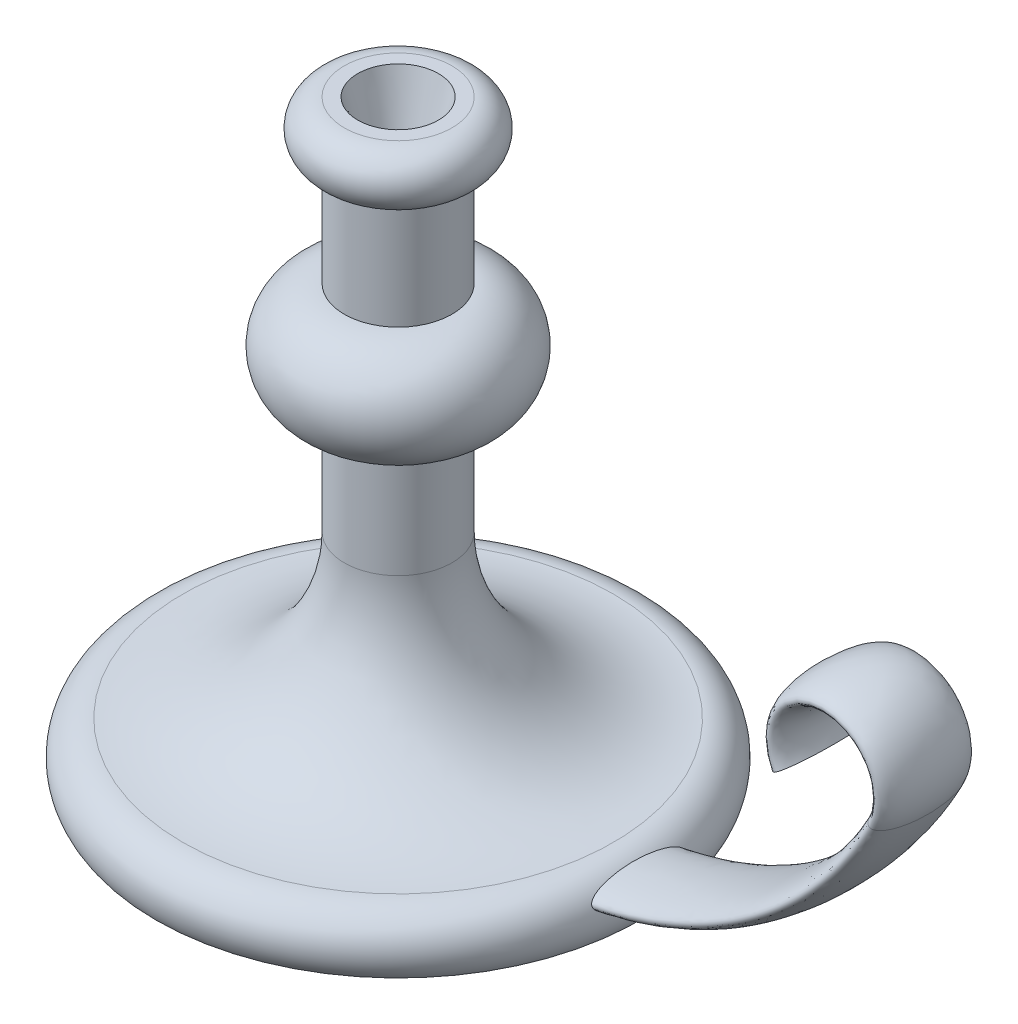
ISO-10303-21;
HEADER;
FILE_DESCRIPTION(('STEP AP214'),'2;1');
FILE_NAME('part.step','',(''),(''),'','','');
FILE_SCHEMA(('AUTOMOTIVE_DESIGN { 1 0 10303 214 1 1 1 1 }'));
ENDSEC;
DATA;
#1=APPLICATION_CONTEXT('core data for automotive mechanical design processes');
#2=APPLICATION_PROTOCOL_DEFINITION('international standard','automotive_design',2000,#1);
#3=PRODUCT_CONTEXT('',#1,'mechanical');
#4=PRODUCT('Part','Part','',(#3));
#5=PRODUCT_RELATED_PRODUCT_CATEGORY('part','',(#4));
#6=PRODUCT_DEFINITION_FORMATION('','',#4);
#7=PRODUCT_DEFINITION_CONTEXT('part definition',#1,'design');
#8=PRODUCT_DEFINITION('design','',#6,#7);
#9=PRODUCT_DEFINITION_SHAPE('','',#8);
#10=(LENGTH_UNIT() NAMED_UNIT(*) SI_UNIT(.MILLI.,.METRE.));
#11=(NAMED_UNIT(*) PLANE_ANGLE_UNIT() SI_UNIT($,.RADIAN.));
#12=(NAMED_UNIT(*) SI_UNIT($,.STERADIAN.) SOLID_ANGLE_UNIT());
#13=UNCERTAINTY_MEASURE_WITH_UNIT(LENGTH_MEASURE(1.E-05),#10,'distance_accuracy_value','');
#14=(GEOMETRIC_REPRESENTATION_CONTEXT(3) GLOBAL_UNCERTAINTY_ASSIGNED_CONTEXT((#13)) GLOBAL_UNIT_ASSIGNED_CONTEXT((#10,
#11,#12)) REPRESENTATION_CONTEXT('',''));
#15=CARTESIAN_POINT('',(0.,0.,0.));
#16=DIRECTION('',(0.,0.,1.));
#17=DIRECTION('',(1.,0.,0.));
#18=AXIS2_PLACEMENT_3D('',#15,#16,#17);
#19=CARTESIAN_POINT('',(90.,0.,0.));
#20=DIRECTION('',(0.,-1.,0.));
#21=DIRECTION('',(0.,0.,-1.));
#22=AXIS2_PLACEMENT_3D('',#19,#20,#21);
#23=PLANE('',#22);
#24=CARTESIAN_POINT('',(0.,0.,0.));
#25=DIRECTION('',(0.,-1.,0.));
#26=DIRECTION('',(0.,0.,-1.));
#27=AXIS2_PLACEMENT_3D('',#24,#25,#26);
#28=CIRCLE('',#27,90.);
#29=CARTESIAN_POINT('',(0.,0.,-90.));
#30=VERTEX_POINT('',#29);
#31=EDGE_CURVE('E79',#30,#30,#28,.T.);
#32=ORIENTED_EDGE('',*,*,#31,.T.);
#33=EDGE_LOOP('',(#32));
#34=FACE_BOUND('',#33,.T.);
#35=ADVANCED_FACE('F39',(#34),#23,.T.);
#36=CARTESIAN_POINT('',(0.,220.,0.));
#37=DIRECTION('',(0.,1.,0.));
#38=DIRECTION('',(0.,0.,1.));
#39=AXIS2_PLACEMENT_3D('',#36,#37,#38);
#40=PLANE('',#39);
#41=CARTESIAN_POINT('',(0.,220.,0.));
#42=DIRECTION('',(0.,1.,0.));
#43=DIRECTION('',(0.,0.,1.));
#44=AXIS2_PLACEMENT_3D('',#41,#42,#43);
#45=CIRCLE('',#44,15.);
#46=CARTESIAN_POINT('',(0.,220.,15.));
#47=VERTEX_POINT('',#46);
#48=EDGE_CURVE('E95',#47,#47,#45,.T.);
#49=ORIENTED_EDGE('',*,*,#48,.F.);
#50=EDGE_LOOP('',(#49));
#51=FACE_BOUND('',#50,.T.);
#52=CARTESIAN_POINT('',(0.,220.,0.));
#53=DIRECTION('',(0.,-1.,0.));
#54=DIRECTION('',(0.,0.,-1.));
#55=AXIS2_PLACEMENT_3D('',#52,#53,#54);
#56=CIRCLE('',#55,20.);
#57=CARTESIAN_POINT('',(0.,220.,-20.));
#58=VERTEX_POINT('',#57);
#59=EDGE_CURVE('E51',#58,#58,#56,.T.);
#60=ORIENTED_EDGE('',*,*,#59,.F.);
#61=EDGE_LOOP('',(#60));
#62=FACE_BOUND('',#61,.T.);
#63=ADVANCED_FACE('F102',(#51,#62),#40,.T.);
#64=CARTESIAN_POINT('',(0.,210.,0.));
#65=DIRECTION('',(0.,-1.,0.));
#66=DIRECTION('',(0.,0.,-1.));
#67=AXIS2_PLACEMENT_3D('',#64,#65,#66);
#68=TOROIDAL_SURFACE('',#67,20.,10.);
#69=ORIENTED_EDGE('',*,*,#59,.T.);
#70=EDGE_LOOP('',(#69));
#71=FACE_BOUND('',#70,.T.);
#72=CARTESIAN_POINT('',(0.,200.,0.));
#73=DIRECTION('',(0.,-1.,0.));
#74=DIRECTION('',(0.,0.,-1.));
#75=AXIS2_PLACEMENT_3D('',#72,#73,#74);
#76=CIRCLE('',#75,20.);
#77=CARTESIAN_POINT('',(0.,200.,-20.));
#78=VERTEX_POINT('',#77);
#79=EDGE_CURVE('E56',#78,#78,#76,.T.);
#80=ORIENTED_EDGE('',*,*,#79,.F.);
#81=EDGE_LOOP('',(#80));
#82=FACE_BOUND('',#81,.T.);
#83=ADVANCED_FACE('F105',(#71,#82),#68,.T.);
#84=CARTESIAN_POINT('',(0.,0.,0.));
#85=DIRECTION('',(0.,-1.,0.));
#86=DIRECTION('',(0.,0.,-1.));
#87=AXIS2_PLACEMENT_3D('',#84,#85,#86);
#88=CYLINDRICAL_SURFACE('',#87,20.);
#89=ORIENTED_EDGE('',*,*,#79,.T.);
#90=EDGE_LOOP('',(#89));
#91=FACE_BOUND('',#90,.T.);
#92=CARTESIAN_POINT('',(0.,160.,0.));
#93=DIRECTION('',(0.,-1.,0.));
#94=DIRECTION('',(0.,0.,-1.));
#95=AXIS2_PLACEMENT_3D('',#92,#93,#94);
#96=CIRCLE('',#95,20.);
#97=CARTESIAN_POINT('',(0.,160.,-20.));
#98=VERTEX_POINT('',#97);
#99=EDGE_CURVE('E61',#98,#98,#96,.T.);
#100=ORIENTED_EDGE('',*,*,#99,.F.);
#101=EDGE_LOOP('',(#100));
#102=FACE_BOUND('',#101,.T.);
#103=ADVANCED_FACE('F110',(#91,#102),#88,.T.);
#104=CARTESIAN_POINT('',(0.,140.,0.));
#105=DIRECTION('',(0.,-1.,0.));
#106=DIRECTION('',(0.,0.,-1.));
#107=AXIS2_PLACEMENT_3D('',#104,#105,#106);
#108=TOROIDAL_SURFACE('',#107,20.,20.);
#109=ORIENTED_EDGE('',*,*,#99,.T.);
#110=EDGE_LOOP('',(#109));
#111=FACE_BOUND('',#110,.T.);
#112=CARTESIAN_POINT('',(0.,120.,0.));
#113=DIRECTION('',(0.,-1.,0.));
#114=DIRECTION('',(0.,0.,-1.));
#115=AXIS2_PLACEMENT_3D('',#112,#113,#114);
#116=CIRCLE('',#115,20.);
#117=CARTESIAN_POINT('',(0.,120.,-20.));
#118=VERTEX_POINT('',#117);
#119=EDGE_CURVE('E67',#118,#118,#116,.T.);
#120=ORIENTED_EDGE('',*,*,#119,.F.);
#121=EDGE_LOOP('',(#120));
#122=FACE_BOUND('',#121,.T.);
#123=ADVANCED_FACE('F116',(#111,#122),#108,.T.);
#124=CARTESIAN_POINT('',(0.,0.,0.));
#125=DIRECTION('',(0.,-1.,0.));
#126=DIRECTION('',(0.,0.,-1.));
#127=AXIS2_PLACEMENT_3D('',#124,#125,#126);
#128=CYLINDRICAL_SURFACE('',#127,20.);
#129=ORIENTED_EDGE('',*,*,#119,.T.);
#130=EDGE_LOOP('',(#129));
#131=FACE_BOUND('',#130,.T.);
#132=CARTESIAN_POINT('',(0.,80.,0.));
#133=DIRECTION('',(0.,-1.,0.));
#134=DIRECTION('',(0.,0.,-1.));
#135=AXIS2_PLACEMENT_3D('',#132,#133,#134);
#136=CIRCLE('',#135,20.);
#137=CARTESIAN_POINT('',(0.,80.,-20.));
#138=VERTEX_POINT('',#137);
#139=EDGE_CURVE('E71',#138,#138,#136,.T.);
#140=ORIENTED_EDGE('',*,*,#139,.F.);
#141=EDGE_LOOP('',(#140));
#142=FACE_BOUND('',#141,.T.);
#143=ADVANCED_FACE('F120',(#131,#142),#128,.T.);
#144=CARTESIAN_POINT('',(0.,80.,0.));
#145=DIRECTION('',(0.,-1.,0.));
#146=DIRECTION('',(0.,0.,-1.));
#147=AXIS2_PLACEMENT_3D('',#144,#145,#146);
#148=TOROIDAL_SURFACE('',#147,80.,60.);
#149=ORIENTED_EDGE('',*,*,#139,.T.);
#150=EDGE_LOOP('',(#149));
#151=FACE_BOUND('',#150,.T.);
#152=CARTESIAN_POINT('',(0.,20.,0.));
#153=DIRECTION('',(0.,-1.,0.));
#154=DIRECTION('',(0.,0.,-1.));
#155=AXIS2_PLACEMENT_3D('',#152,#153,#154);
#156=CIRCLE('',#155,80.);
#157=CARTESIAN_POINT('',(0.,20.,-80.));
#158=VERTEX_POINT('',#157);
#159=EDGE_CURVE('E75',#158,#158,#156,.T.);
#160=ORIENTED_EDGE('',*,*,#159,.F.);
#161=EDGE_LOOP('',(#160));
#162=FACE_BOUND('',#161,.T.);
#163=ADVANCED_FACE('F124',(#151,#162),#148,.F.);
#164=CARTESIAN_POINT('',(0.,7.50000000000001,0.));
#165=DIRECTION('',(0.,-1.,0.));
#166=DIRECTION('',(0.,0.,-1.));
#167=AXIS2_PLACEMENT_3D('',#164,#165,#166);
#168=TOROIDAL_SURFACE('',#167,80.,12.5);
#169=CARTESIAN_POINT('',(89.5597422043342,12.9414346567555,-17.5));
#170=CARTESIAN_POINT('',(89.5390582646493,12.9834173617915,-17.499999529555));
#171=CARTESIAN_POINT('',(89.5184733436256,13.0254521017429,-17.4978437200626));
#172=CARTESIAN_POINT('',(89.4776702826154,13.1092549607238,-17.4892830466629));
#173=CARTESIAN_POINT('',(89.4574521621599,13.1510230654795,-17.4828779571716));
#174=CARTESIAN_POINT('',(89.3975361659609,13.2754865740816,-17.4575126778008));
#175=CARTESIAN_POINT('',(89.3585788088466,13.3573367938186,-17.4324025033007));
#176=CARTESIAN_POINT('',(89.2734496783785,13.5378991210076,-17.359750745902));
#177=CARTESIAN_POINT('',(89.2281287481662,13.6352786062871,-17.3080101483247));
#178=CARTESIAN_POINT('',(89.1421720362306,13.8217234249217,-17.1881910821645));
#179=CARTESIAN_POINT('',(89.1015482124202,13.9107674327476,-17.120072217393));
#180=CARTESIAN_POINT('',(89.0298701708906,14.0690278575786,-16.9825130656438));
#181=CARTESIAN_POINT('',(88.9982670402754,14.1392904001454,-16.914527892612));
#182=CARTESIAN_POINT('',(88.9378084901095,14.2743700522504,-16.7721639183641));
#183=CARTESIAN_POINT('',(88.9089553389789,14.3391826611135,-16.6977799334454));
#184=CARTESIAN_POINT('',(88.8535705249382,14.4640519004397,-16.5441014251969));
#185=CARTESIAN_POINT('',(88.8270433068887,14.5240994048582,-16.4647979739712));
#186=CARTESIAN_POINT('',(88.7760242106981,14.639888292799,-16.30254064417));
#187=CARTESIAN_POINT('',(88.7515317774409,14.6956308504738,-16.2195877707139));
#188=CARTESIAN_POINT('',(88.7011145466114,14.8105653330702,-16.0395041506132));
#189=CARTESIAN_POINT('',(88.6754372904236,14.8692192492853,-15.9419625876567));
#190=CARTESIAN_POINT('',(88.6259626108054,14.9823236097612,-15.7440123374179));
#191=CARTESIAN_POINT('',(88.6021653935475,15.0367735929872,-15.6436033373203));
#192=CARTESIAN_POINT('',(88.556218747994,15.141891515871,-15.4406966958936));
#193=CARTESIAN_POINT('',(88.5340665134383,15.192565897041,-15.3382030101851));
#194=CARTESIAN_POINT('',(88.4911474883075,15.2906566336401,-15.131399046184));
#195=CARTESIAN_POINT('',(88.4703806136357,15.3380731868372,-15.0270888786445));
#196=CARTESIAN_POINT('',(88.4231748494219,15.4456842383053,-14.7811352794731));
#197=CARTESIAN_POINT('',(88.397217285615,15.5047207824597,-14.638893242116));
#198=CARTESIAN_POINT('',(88.3471341894953,15.6182640114392,-14.3522843012951));
#199=CARTESIAN_POINT('',(88.3230089155691,15.6727700574822,-14.2079171015583));
#200=CARTESIAN_POINT('',(88.2763127006042,15.7778416014024,-13.9173271969793));
#201=CARTESIAN_POINT('',(88.2537435098181,15.828402670193,-13.7711026149678));
#202=CARTESIAN_POINT('',(88.2099900728492,15.9259520699222,-13.4772575324595));
#203=CARTESIAN_POINT('',(88.1888059144681,15.9729401743897,-13.329636944143));
#204=CARTESIAN_POINT('',(88.1270679902021,16.1091377763187,-12.8849045643969));
#205=CARTESIAN_POINT('',(88.0883500790955,16.1935326219637,-12.586057179069));
#206=CARTESIAN_POINT('',(88.0146874577696,16.3521379228748,-11.9832421559104));
#207=CARTESIAN_POINT('',(87.9797677044048,16.4262817935622,-11.679254235463));
#208=CARTESIAN_POINT('',(87.9134290299724,16.5652655011775,-11.0690426265186));
#209=CARTESIAN_POINT('',(87.8820074126126,16.6301125151852,-10.7628208565616));
#210=CARTESIAN_POINT('',(87.8222678834472,16.7517102611969,-10.1485521184746));
#211=CARTESIAN_POINT('',(87.7939493322553,16.808462661824,-9.84050554018649));
#212=CARTESIAN_POINT('',(87.7363643277581,16.9222889518736,-9.17921602237407));
#213=CARTESIAN_POINT('',(87.7075311486807,16.9782711274441,-8.8257479677194));
#214=CARTESIAN_POINT('',(87.6533805146216,17.081845568475,-8.11730418521358));
#215=CARTESIAN_POINT('',(87.6280632769497,17.1294373153974,-7.76232836556822));
#216=CARTESIAN_POINT('',(87.5808221791778,17.2170184649246,-7.05090687995851));
#217=CARTESIAN_POINT('',(87.5589012572657,17.2570012917244,-6.69446021217684));
#218=CARTESIAN_POINT('',(87.5184403236416,17.3298891966212,-5.98064845198715));
#219=CARTESIAN_POINT('',(87.499900432546,17.3627940222216,-5.62328332727467));
#220=CARTESIAN_POINT('',(87.4493194067674,17.4516433104774,-4.54944105890017));
#221=CARTESIAN_POINT('',(87.4223606775334,17.4976432128735,-3.83187725769425));
#222=CARTESIAN_POINT('',(87.3822063836004,17.5655025218576,-2.39488144776424));
#223=CARTESIAN_POINT('',(87.3690182647398,17.5873488688719,-1.67544863898468));
#224=CARTESIAN_POINT('',(87.3566302444808,17.6078824191266,-0.235644843258097));
#225=CARTESIAN_POINT('',(87.3574397198795,17.6065540979683,0.484726449317174));
#226=CARTESIAN_POINT('',(87.3730503729221,17.5806479894321,1.92437411686843));
#227=CARTESIAN_POINT('',(87.3878414383715,17.5560870050851,2.6436509068947));
#228=CARTESIAN_POINT('',(87.4311616214853,17.4826189475648,4.07999015680195));
#229=CARTESIAN_POINT('',(87.4596792404211,17.4337322508757,4.79705396541162));
#230=CARTESIAN_POINT('',(87.5125859960336,17.3402847300944,5.87013028409041));
#231=CARTESIAN_POINT('',(87.5319025446346,17.3057962086567,6.22729408711339));
#232=CARTESIAN_POINT('',(87.5739214244642,17.2296205667248,6.94064948544713));
#233=CARTESIAN_POINT('',(87.5966236399416,17.1879336923245,7.29684111357141));
#234=CARTESIAN_POINT('',(87.6475492029271,17.0928592178445,8.03835643271933));
#235=CARTESIAN_POINT('',(87.6760784643934,17.0387764600915,8.42357062174196));
#236=CARTESIAN_POINT('',(87.7373548846417,16.9203608161937,9.19219037730575));
#237=CARTESIAN_POINT('',(87.7701030340522,16.8560255218281,9.57559549707481));
#238=CARTESIAN_POINT('',(87.8401688236657,16.7156476795249,10.3401842756175));
#239=CARTESIAN_POINT('',(87.8774902578689,16.6395953975255,10.7213658113223));
#240=CARTESIAN_POINT('',(87.9570416295433,16.4743397550469,11.4781475614305));
#241=CARTESIAN_POINT('',(87.9992429029768,16.3852124414308,11.8537670788625));
#242=CARTESIAN_POINT('',(88.0670993507819,16.2393583280544,12.4133552220522));
#243=CARTESIAN_POINT('',(88.0904707006304,16.1887275949605,12.5991973998153));
#244=CARTESIAN_POINT('',(88.1389309634382,16.0829221921757,12.9693534861926));
#245=CARTESIAN_POINT('',(88.16401976458,16.027747818259,13.1536674934266));
#246=CARTESIAN_POINT('',(88.2161331237674,15.9123388324788,13.5201919633462));
#247=CARTESIAN_POINT('',(88.2431553678556,15.8521102550711,13.7024046472505));
#248=CARTESIAN_POINT('',(88.2994911591521,15.7258019169329,14.0644192463428));
#249=CARTESIAN_POINT('',(88.328804369627,15.6597230159119,14.2442215112873));
#250=CARTESIAN_POINT('',(88.3836208406568,15.5355918222259,14.5626076263878));
#251=CARTESIAN_POINT('',(88.4085995668659,15.4788420394123,14.7017884768663));
#252=CARTESIAN_POINT('',(88.4605571793012,15.3605039925616,14.9777384975734));
#253=CARTESIAN_POINT('',(88.4875363569545,15.2989150234703,15.1145073128084));
#254=CARTESIAN_POINT('',(88.5438868395599,15.1701159007169,15.3849538383595));
#255=CARTESIAN_POINT('',(88.573259087404,15.1029035310993,15.518630303366));
#256=CARTESIAN_POINT('',(88.6348905409966,14.9619075979837,15.7817828843055));
#257=CARTESIAN_POINT('',(88.6671488360372,14.8881261074429,15.9112603078201));
#258=CARTESIAN_POINT('',(88.7233955650872,14.7597494730677,16.1203829539575));
#259=CARTESIAN_POINT('',(88.7463553345352,14.7074126408098,16.2016896405191));
#260=CARTESIAN_POINT('',(88.7940412142379,14.5989607695909,16.3611960861376));
#261=CARTESIAN_POINT('',(88.81876688049,14.5428466805549,16.4393966185389));
#262=CARTESIAN_POINT('',(88.8702506115276,14.4263935383169,16.5917529324728));
#263=CARTESIAN_POINT('',(88.8970061055779,14.3660598364959,16.6659136323199));
#264=CARTESIAN_POINT('',(88.9529032541949,14.2405801946457,16.8090437512335));
#265=CARTESIAN_POINT('',(88.9820435228339,14.1754370517799,16.8780161414127));
#266=CARTESIAN_POINT('',(89.0487212080264,14.0272515904163,17.0212134084463));
#267=CARTESIAN_POINT('',(89.0868179985466,13.9431190326695,17.0940771816603));
#268=CARTESIAN_POINT('',(89.1674590422737,13.7666653208522,17.22622488831));
#269=CARTESIAN_POINT('',(89.2099966566075,13.6743564205665,17.2855286817063));
#270=CARTESIAN_POINT('',(89.2906982829627,13.501256394413,17.3752136840057));
#271=CARTESIAN_POINT('',(89.3280187495529,13.4218877671498,17.4090140203461));
#272=CARTESIAN_POINT('',(89.3858696335243,13.3001584292802,17.4484697433751));
#273=CARTESIAN_POINT('',(89.4054636362959,13.2591386460421,17.4597471563876));
#274=CARTESIAN_POINT('',(89.4451772577242,13.176457933936,17.4782793700785));
#275=CARTESIAN_POINT('',(89.4652966517104,13.1347972821528,17.4855358616365));
#276=CARTESIAN_POINT('',(89.5060448705136,13.0509093203992,17.4958517343001));
#277=CARTESIAN_POINT('',(89.5266759336062,13.0086801379587,17.4988871358903));
#278=CARTESIAN_POINT('',(89.5681737453562,12.9242504345389,17.5006038092949));
#279=CARTESIAN_POINT('',(89.5890404859095,12.8820499126267,17.4992852303762));
#280=CARTESIAN_POINT('',(89.6308462994767,12.798022283734,17.492350321561));
#281=CARTESIAN_POINT('',(89.6517853970305,12.7561953252251,17.4867323536224));
#282=CARTESIAN_POINT('',(89.6935737267727,12.6732390127591,17.4713819736299));
#283=CARTESIAN_POINT('',(89.7144229082856,12.6321100214489,17.4616474869386));
#284=CARTESIAN_POINT('',(89.7590814534652,12.5445597652693,17.4365496369135));
#285=CARTESIAN_POINT('',(89.7828513714225,12.4983007261468,17.4205496417386));
#286=CARTESIAN_POINT('',(89.8299138735251,12.4073591496394,17.3839789557362));
#287=CARTESIAN_POINT('',(89.8532061253689,12.3626776951248,17.3634051934891));
#288=CARTESIAN_POINT('',(89.9222890749045,12.2310774637925,17.295582320116));
#289=CARTESIAN_POINT('',(89.9671973117301,12.1467762649252,17.2422849793833));
#290=CARTESIAN_POINT('',(90.0459474020626,12.0008499863255,17.1351551269542));
#291=CARTESIAN_POINT('',(90.0802751503674,11.9379527528801,17.0833327862496));
#292=CARTESIAN_POINT('',(90.1471086547054,11.8167142700177,16.9737569386442));
#293=CARTESIAN_POINT('',(90.1796168786988,11.7583668049535,16.9160117822271));
#294=CARTESIAN_POINT('',(90.2430544886623,11.6455753357716,16.7956947496162));
#295=CARTESIAN_POINT('',(90.2739789081924,11.5911434169178,16.7331090713725));
#296=CARTESIAN_POINT('',(90.3342954740116,11.4859222301367,16.6042321753447));
#297=CARTESIAN_POINT('',(90.3636870842166,11.4351342343308,16.5379396777147));
#298=CARTESIAN_POINT('',(90.4432885515011,11.2987399755807,16.3499536470143));
#299=CARTESIAN_POINT('',(90.492000935312,11.2166155464064,16.2250996740017));
#300=CARTESIAN_POINT('',(90.5857601617712,11.06063465676,15.9688661320462));
#301=CARTESIAN_POINT('',(90.6308017977522,10.9867898864376,15.8374777053981));
#302=CARTESIAN_POINT('',(90.7177331520491,10.8459963580412,15.5699524387931));
#303=CARTESIAN_POINT('',(90.7596207045016,10.7790523271731,15.4338124282058));
#304=CARTESIAN_POINT('',(90.8408342022972,10.6507070014434,15.1573468606088));
#305=CARTESIAN_POINT('',(90.8801464748,10.5893347136458,15.0170039528443));
#306=CARTESIAN_POINT('',(90.956283450044,10.4717040419739,14.733704836711));
#307=CARTESIAN_POINT('',(90.9931104449965,10.4154409288003,14.5907511953049));
#308=CARTESIAN_POINT('',(91.0645685893264,10.3073161285722,14.3027039651383));
#309=CARTESIAN_POINT('',(91.0992003079713,10.2554532992687,14.1576109432793));
#310=CARTESIAN_POINT('',(91.186364749306,10.1260777892219,13.7794377250049));
#311=CARTESIAN_POINT('',(91.2373897972936,10.0515067650778,13.5450025956114));
#312=CARTESIAN_POINT('',(91.3350967397622,9.91047021929333,13.0727910819174));
#313=CARTESIAN_POINT('',(91.3817777133239,9.84400641541401,12.8350140013839));
#314=CARTESIAN_POINT('',(91.4713219759596,9.71792560422127,12.3565177396184));
#315=CARTESIAN_POINT('',(91.5141788566395,9.65832004326956,12.1157943609829));
#316=CARTESIAN_POINT('',(91.5963414987142,9.54518687339824,11.6323107127138));
#317=CARTESIAN_POINT('',(91.6356469672692,9.49165976559829,11.3895502769104));
#318=CARTESIAN_POINT('',(91.7110002774053,9.38996215682617,10.9022185814798));
#319=CARTESIAN_POINT('',(91.7470456612456,9.34179569097782,10.6576461035991));
#320=CARTESIAN_POINT('',(91.8160558173786,9.25032535040194,10.1671568932828));
#321=CARTESIAN_POINT('',(91.8490204492382,9.20702169732312,9.92124010010812));
#322=CARTESIAN_POINT('',(91.94371654713,9.08351874139019,9.18054197897053));
#323=CARTESIAN_POINT('',(92.0010573402181,9.00998542718558,8.68407474470497));
#324=CARTESIAN_POINT('',(92.104969097034,8.87816731427822,7.68862064231465));
#325=CARTESIAN_POINT('',(92.1515519970991,8.81986560594103,7.18963720055161));
#326=CARTESIAN_POINT('',(92.234662530804,8.71671231278769,6.18960332694882));
#327=CARTESIAN_POINT('',(92.2711930907959,8.67185681328479,5.68855353984834));
#328=CARTESIAN_POINT('',(92.3290033746742,8.60130236571153,4.77421646813067));
#329=CARTESIAN_POINT('',(92.3518401767655,8.57361494665986,4.36117722549697));
#330=CARTESIAN_POINT('',(92.3911874542591,8.52608630212813,3.53433359924653));
#331=CARTESIAN_POINT('',(92.4076977279018,8.50624532687874,3.12052919165068));
#332=CARTESIAN_POINT('',(92.4345116703053,8.47409543678101,2.29215786118009));
#333=CARTESIAN_POINT('',(92.4448112640529,8.46179146710421,1.87759061629819));
#334=CARTESIAN_POINT('',(92.4592535583783,8.44455440327106,1.04818440938587));
#335=CARTESIAN_POINT('',(92.4633960790649,8.43962152447593,0.633345439770713));
#336=CARTESIAN_POINT('',(92.4655505632339,8.43705485812391,-0.196670813514184));
#337=CARTESIAN_POINT('',(92.463558090994,8.43942635177453,-0.611848124886993));
#338=CARTESIAN_POINT('',(92.4534204253799,8.45151420462228,-1.44202047495076));
#339=CARTESIAN_POINT('',(92.4452752461708,8.46123054690971,-1.85701551405916));
#340=CARTESIAN_POINT('',(92.4228333568243,8.48808680209822,-2.68463035796091));
#341=CARTESIAN_POINT('',(92.4085659783753,8.5051913205201,-3.09725209981679));
#342=CARTESIAN_POINT('',(92.3737916566561,8.54707230746262,-3.92183078930213));
#343=CARTESIAN_POINT('',(92.3532849363499,8.57184850183528,-4.33378776015853));
#344=CARTESIAN_POINT('',(92.3059024818022,8.62944483704932,-5.15652486840816));
#345=CARTESIAN_POINT('',(92.2790306054308,8.66226010588295,-5.56730556669245));
#346=CARTESIAN_POINT('',(92.2187084179273,8.73649037844418,-6.38758950721626));
#347=CARTESIAN_POINT('',(92.185258460981,8.77790491916504,-6.7970928170292));
#348=CARTESIAN_POINT('',(92.1115283368606,8.87005193709239,-7.61406284599629));
#349=CARTESIAN_POINT('',(92.0712543461805,8.9207759915974,-8.02153106680115));
#350=CARTESIAN_POINT('',(91.9834693160505,9.0325920936081,-8.83423730827437));
#351=CARTESIAN_POINT('',(91.9359590751541,9.09368299716896,-9.2394755699225));
#352=CARTESIAN_POINT('',(91.8543557692522,9.20003882243966,-9.88042690900025));
#353=CARTESIAN_POINT('',(91.8228129071746,9.24143612630448,-10.1171113156888));
#354=CARTESIAN_POINT('',(91.7568879600589,9.32869788454411,-10.5892621875812));
#355=CARTESIAN_POINT('',(91.7225058955844,9.37456230656506,-10.8247286615931));
#356=CARTESIAN_POINT('',(91.6507155309858,9.47123493395967,-11.294217602376));
#357=CARTESIAN_POINT('',(91.6133068406489,9.52204377697294,-11.5282398787518));
#358=CARTESIAN_POINT('',(91.5352356990089,9.62919379400359,-11.9944712394994));
#359=CARTESIAN_POINT('',(91.4945733147078,9.6855348541036,-12.2266803611006));
#360=CARTESIAN_POINT('',(91.4114366220567,9.80207039988227,-12.6793571911577));
#361=CARTESIAN_POINT('',(91.3691050330568,9.86201205901661,-12.899915844764));
#362=CARTESIAN_POINT('',(91.2808339383599,9.98855020962444,-13.3383860854041));
#363=CARTESIAN_POINT('',(91.2348946792169,10.0551462464116,-13.5562978521572));
#364=CARTESIAN_POINT('',(91.1389255885711,10.1961851010647,-13.9888063977781));
#365=CARTESIAN_POINT('',(91.0888935897908,10.270632082448,-14.2034013478043));
#366=CARTESIAN_POINT('',(90.98415319371,10.4288882406833,-14.6279375290358));
#367=CARTESIAN_POINT('',(90.9294461710573,10.5126946676854,-14.8378801055193));
#368=CARTESIAN_POINT('',(90.8366940233269,10.6572679346541,-15.1713365517305));
#369=CARTESIAN_POINT('',(90.8003798753651,10.7144227566668,-15.2968977366505));
#370=CARTESIAN_POINT('',(90.7253897856816,10.8337907143199,-15.5448599456957));
#371=CARTESIAN_POINT('',(90.6867143533612,10.8960027599159,-15.667261643369));
#372=CARTESIAN_POINT('',(90.6067167057864,11.0262717962457,-15.9078026411004));
#373=CARTESIAN_POINT('',(90.5653983156485,11.0943203863983,-16.0259477309014));
#374=CARTESIAN_POINT('',(90.4796489934976,11.2374428239512,-16.2567420693089));
#375=CARTESIAN_POINT('',(90.4352193316521,11.3125138086348,-16.3693935291768));
#376=CARTESIAN_POINT('',(90.3645295106905,11.4337214569242,-16.5357258364229));
#377=CARTESIAN_POINT('',(90.3395739146874,11.476821640204,-16.5921790279252));
#378=CARTESIAN_POINT('',(90.2885695659787,11.5656177158065,-16.7024563444323));
#379=CARTESIAN_POINT('',(90.2625213333875,11.6113123766941,-16.7562816945146));
#380=CARTESIAN_POINT('',(90.20925802777,11.7055370383737,-16.8607091080394));
#381=CARTESIAN_POINT('',(90.1820439781251,11.7540645654546,-16.9113139053352));
#382=CARTESIAN_POINT('',(90.1263125080179,11.8543244483277,-17.0086709892273));
#383=CARTESIAN_POINT('',(90.0977930481723,11.9060618669396,-17.0554169041199));
#384=CARTESIAN_POINT('',(90.0243000053553,12.040627075792,-17.167014526218));
#385=CARTESIAN_POINT('',(89.9784553100018,12.1256778584936,-17.2287027522837));
#386=CARTESIAN_POINT('',(89.8839550632913,12.3036838839735,-17.336283402217));
#387=CARTESIAN_POINT('',(89.8353087238778,12.3966136483515,-17.3822244876003));
#388=CARTESIAN_POINT('',(89.7485690868851,12.5649331711617,-17.4442519684825));
#389=CARTESIAN_POINT('',(89.7109173565325,12.6388170673189,-17.4649498669614));
#390=CARTESIAN_POINT('',(89.6542222447601,12.7513539412056,-17.4858673061404));
#391=CARTESIAN_POINT('',(89.6352849183996,12.7891568906557,-17.4911515818637));
#392=CARTESIAN_POINT('',(89.5974518287431,12.865103829663,-17.4982176377447));
#393=CARTESIAN_POINT('',(89.5785560550327,12.903247717686,-17.5000004279109));
#394=CARTESIAN_POINT('',(89.5597422043342,12.9414346567555,-17.5));
#395=B_SPLINE_CURVE_WITH_KNOTS('',3,(#169,#170,#171,#172,#173,#174,#175,#176,#177,#178,#179,
#180,#181,#182,#183,#184,#185,#186,#187,#188,#189,#190,#191,#192,#193,#194,#195,#196,#197,#198,
#199,#200,#201,#202,#203,#204,#205,#206,#207,#208,#209,#210,#211,#212,#213,#214,#215,#216,#217,
#218,#219,#220,#221,#222,#223,#224,#225,#226,#227,#228,#229,#230,#231,#232,#233,#234,#235,#236,
#237,#238,#239,#240,#241,#242,#243,#244,#245,#246,#247,#248,#249,#250,#251,#252,#253,#254,#255,
#256,#257,#258,#259,#260,#261,#262,#263,#264,#265,#266,#267,#268,#269,#270,#271,#272,#273,#274,
#275,#276,#277,#278,#279,#280,#281,#282,#283,#284,#285,#286,#287,#288,#289,#290,#291,#292,#293,
#294,#295,#296,#297,#298,#299,#300,#301,#302,#303,#304,#305,#306,#307,#308,#309,#310,#311,#312,
#313,#314,#315,#316,#317,#318,#319,#320,#321,#322,#323,#324,#325,#326,#327,#328,#329,#330,#331,
#332,#333,#334,#335,#336,#337,#338,#339,#340,#341,#342,#343,#344,#345,#346,#347,#348,#349,#350,
#351,#352,#353,#354,#355,#356,#357,#358,#359,#360,#361,#362,#363,#364,#365,#366,#367,#368,#369,
#370,#371,#372,#373,#374,#375,#376,#377,#378,#379,#380,#381,#382,#383,#384,#385,#386,#387,#388,
#389,#390,#391,#392,#393,#394),.UNSPECIFIED.,.T.,.F.,(4,2,2,2,2,2,2,2,2,2,2,2,2,2,2,2,2,2,2,2,2,
2,2,2,2,2,2,2,2,2,2,2,2,2,2,2,2,2,2,2,2,2,2,2,2,2,2,2,2,2,2,2,2,2,2,2,2,2,2,2,2,2,2,2,2,2,2,2,2,
2,2,2,2,2,2,2,2,2,2,2,2,2,2,2,2,2,2,2,2,2,2,2,2,2,2,2,2,2,2,2,2,2,2,2,2,2,2,2,2,2,2,2,4),(0.,
0.14035626727617,0.28071998631602,0.561461846564191,0.9171589167921,1.27374246212512,
1.58155340799504,1.88961610427831,2.19825523044174,2.50680987735367,2.85669232641104,
3.20661309186319,3.55592250055269,3.90521068549213,4.373634513836,4.84212427640925,
5.31113266930393,5.78017076539178,6.71868106149067,7.66302659999205,8.60663914164762,
9.55005688506852,10.6270218001197,11.7040532495174,12.782011308991,13.8600078165315,
16.0179985073061,18.1771554312427,20.3377588008925,22.4968007073251,24.6540371245626,
25.7319988670265,26.8099237639333,27.9798904457039,29.1501323473971,30.3213517401831,
31.4860109808437,32.0680431194701,32.6500373998796,33.2313464351857,33.8125701880162,
34.2695828226852,34.7266621665537,35.1839224830357,35.6410390140514,35.9390800353941,
36.237046381792,36.5346414650166,36.8320648105834,37.1841020847494,37.5356204141955,
37.8163710598435,37.9567282988678,38.097026469925,38.2381184468107,38.3792055867118,
38.5203465067662,38.661558643761,38.8245522618513,38.9876556673845,39.3144607002644,
39.5794176337111,39.8440060137476,40.1093788084443,40.3748438005091,40.8458108324087,
41.3174346702702,41.789379466594,42.2636550823958,42.7374871127105,43.2111957644655,
43.9646803432339,44.7183242943163,45.4732083660834,46.2281546268685,46.9836653698977,
47.739210535405,49.2542043028636,50.7675089569101,52.2803726033677,53.5240382809724,
54.76774361708,56.0122641001246,57.2568209436229,58.5022778378082,59.7477318646422,
60.9872843531233,62.2267925512055,63.4655514069569,64.7042435820585,65.9418205368635,
67.1792610181599,67.9062273701563,68.6331884573673,69.3602434190731,70.08728341267,
70.784503890096,71.4816767597475,72.1792212317147,72.8765612982854,73.3044190976515,
73.7321849189487,74.1593450664402,74.5863318324333,74.8120982985312,75.0377584890315,
75.2632244938334,75.4890556317002,75.8318615693043,76.1735984170503,76.4289321759135,
76.5566353081985,76.6843015989224),.UNSPECIFIED.);
#396=CARTESIAN_POINT('',(89.5597422043342,12.9414346567555,-17.5));
#397=VERTEX_POINT('',#396);
#398=EDGE_CURVE('E10',#397,#397,#395,.T.);
#399=ORIENTED_EDGE('',*,*,#398,.F.);
#400=EDGE_LOOP('',(#399));
#401=FACE_BOUND('',#400,.T.);
#402=ORIENTED_EDGE('',*,*,#159,.T.);
#403=EDGE_LOOP('',(#402));
#404=FACE_BOUND('',#403,.T.);
#405=ORIENTED_EDGE('',*,*,#31,.F.);
#406=EDGE_LOOP('',(#405));
#407=FACE_BOUND('',#406,.T.);
#408=ADVANCED_FACE('F127',(#401,#404,#407),#168,.T.);
#409=CARTESIAN_POINT('',(157.286055742071,89.99585280385,0.));
#410=DIRECTION('',(0.466694314640998,-0.884418688564285,0.));
#411=DIRECTION('',(0.,0.,-1.));
#412=AXIS2_PLACEMENT_3D('',#409,#410,#411);
#413=PLANE('',#412);
#414=CARTESIAN_POINT('',(157.286055742071,89.99585280385,0.));
#415=DIRECTION('',(0.466694314640998,-0.884418688564285,0.));
#416=DIRECTION('',(0.,0.,-1.));
#417=AXIS2_PLACEMENT_3D('',#414,#415,#416);
#418=ELLIPSE('',#417,17.5,5.);
#419=CARTESIAN_POINT('',(157.286055742071,89.99585280385,-17.5));
#420=VERTEX_POINT('',#419);
#421=EDGE_CURVE('E83',#420,#420,#418,.T.);
#422=ORIENTED_EDGE('',*,*,#421,.T.);
#423=EDGE_LOOP('',(#422));
#424=FACE_BOUND('',#423,.T.);
#425=ADVANCED_FACE('F132',(#424),#413,.T.);
#426=CARTESIAN_POINT('',(60.,9.99999999999998,-17.5));
#427=CARTESIAN_POINT('',(117.107136457836,9.99999999999997,-17.5));
#428=CARTESIAN_POINT('',(166.011227374342,39.4892340701488,-17.5));
#429=CARTESIAN_POINT('',(192.662803284642,89.9958528038498,-17.5));
#430=CARTESIAN_POINT('',(60.,20.,-17.5));
#431=CARTESIAN_POINT('',(113.299994027314,20.,-17.5));
#432=CARTESIAN_POINT('',(158.943812216053,47.5232851321388,-17.5));
#433=CARTESIAN_POINT('',(183.818616399,94.6627959502598,-17.5));
#434=CARTESIAN_POINT('',(60.,20.,17.5));
#435=CARTESIAN_POINT('',(113.299994027314,20.,17.5));
#436=CARTESIAN_POINT('',(158.943812216053,47.5232851321388,17.5));
#437=CARTESIAN_POINT('',(183.818616399,94.6627959502598,17.5));
#438=CARTESIAN_POINT('',(60.,9.99999999999998,17.5));
#439=CARTESIAN_POINT('',(117.107136457836,9.99999999999997,17.5));
#440=CARTESIAN_POINT('',(166.011227374342,39.4892340701488,17.5));
#441=CARTESIAN_POINT('',(192.662803284642,89.9958528038498,17.5));
#442=CARTESIAN_POINT('',(60.,0.,17.5));
#443=CARTESIAN_POINT('',(120.914278888359,0.,17.5));
#444=CARTESIAN_POINT('',(173.078642532632,31.4551830081587,17.5));
#445=CARTESIAN_POINT('',(201.506990170285,85.3289096574398,17.5));
#446=CARTESIAN_POINT('',(60.,0.,-17.5));
#447=CARTESIAN_POINT('',(120.914278888359,0.,-17.5));
#448=CARTESIAN_POINT('',(173.078642532632,31.4551830081587,-17.5));
#449=CARTESIAN_POINT('',(201.506990170285,85.3289096574398,-17.5));
#450=CARTESIAN_POINT('',(60.,9.99999999999998,-17.5));
#451=CARTESIAN_POINT('',(117.107136457836,9.99999999999997,-17.5));
#452=CARTESIAN_POINT('',(166.011227374342,39.4892340701488,-17.5));
#453=CARTESIAN_POINT('',(192.662803284642,89.9958528038498,-17.5));
#454=(BOUNDED_SURFACE() B_SPLINE_SURFACE(3,3,((#426,#427,#428,#429),(#430,#431,#432,#433),(#434,
#435,#436,#437),(#438,#439,#440,#441),(#442,#443,#444,#445),(#446,#447,#448,#449),(#450,#451,
#452,#453)),.UNSPECIFIED.,.T.,.F.,.F.) B_SPLINE_SURFACE_WITH_KNOTS((4,3,4),(4,4),(0.,0.5,1.),
(0.,1.),.UNSPECIFIED.) GEOMETRIC_REPRESENTATION_ITEM() RATIONAL_B_SPLINE_SURFACE(((1.,
0.904237940006131,0.904237940006131,1.),(0.333333333333333,0.301412646668711,0.301412646668711,
0.333333333333333),(0.333333333333333,0.301412646668711,0.301412646668711,0.333333333333333),
(1.,0.904237940006131,0.904237940006131,1.),(0.333333333333333,0.301412646668711,
0.301412646668711,0.333333333333333),(0.333333333333333,0.301412646668711,0.301412646668711,
0.333333333333333),(1.,0.904237940006131,0.904237940006131,1.))) REPRESENTATION_ITEM('') SURFACE());
#455=CARTESIAN_POINT('',(192.662803284642,89.9958528038498,0.));
#456=DIRECTION('',(0.466694314641001,0.884418688564283,0.));
#457=DIRECTION('',(0.,0.,-1.));
#458=AXIS2_PLACEMENT_3D('',#455,#456,#457);
#459=ELLIPSE('',#458,17.5,5.);
#460=CARTESIAN_POINT('',(192.662803284642,89.9958528038498,-17.5));
#461=VERTEX_POINT('',#460);
#462=EDGE_CURVE('E87',#461,#461,#459,.T.);
#463=ORIENTED_EDGE('',*,*,#398,.T.);
#464=EDGE_LOOP('',(#463));
#465=FACE_BOUND('',#464,.T.);
#466=ORIENTED_EDGE('',*,*,#462,.F.);
#467=EDGE_LOOP('',(#466));
#468=FACE_BOUND('',#467,.T.);
#469=ADVANCED_FACE('F137',(#465,#468),#454,.T.);
#470=CARTESIAN_POINT('',(192.662803284642,89.9958528038498,-17.5));
#471=CARTESIAN_POINT('',(200.527089738568,104.899231083537,-17.5));
#472=CARTESIAN_POINT('',(191.82547356341,119.32973909667,-17.5));
#473=CARTESIAN_POINT('',(174.974429513357,119.32973909667,-17.5));
#474=CARTESIAN_POINT('',(158.123385463303,119.32973909667,-17.5));
#475=CARTESIAN_POINT('',(149.421769288146,104.899231083537,-17.5));
#476=CARTESIAN_POINT('',(157.286055742071,89.99585280385,-17.5));
#477=CARTESIAN_POINT('',(183.818616399,94.6627959502599,-17.5));
#478=CARTESIAN_POINT('',(187.750759625962,102.114485090104,-17.5));
#479=CARTESIAN_POINT('',(183.399951538384,109.32973909667,-17.5));
#480=CARTESIAN_POINT('',(174.974429513357,109.32973909667,-17.5));
#481=CARTESIAN_POINT('',(166.54890748833,109.32973909667,-17.5));
#482=CARTESIAN_POINT('',(162.198099400751,102.114485090104,-17.5));
#483=CARTESIAN_POINT('',(166.130242627714,94.6627959502599,-17.5));
#484=CARTESIAN_POINT('',(183.818616399,94.6627959502599,17.5));
#485=CARTESIAN_POINT('',(187.750759625962,102.114485090104,17.5));
#486=CARTESIAN_POINT('',(183.399951538384,109.32973909667,17.5));
#487=CARTESIAN_POINT('',(174.974429513357,109.32973909667,17.5));
#488=CARTESIAN_POINT('',(166.54890748833,109.32973909667,17.5));
#489=CARTESIAN_POINT('',(162.198099400751,102.114485090104,17.5));
#490=CARTESIAN_POINT('',(166.130242627714,94.6627959502599,17.5));
#491=CARTESIAN_POINT('',(192.662803284642,89.9958528038498,17.5));
#492=CARTESIAN_POINT('',(200.527089738568,104.899231083537,17.5));
#493=CARTESIAN_POINT('',(191.82547356341,119.32973909667,17.5));
#494=CARTESIAN_POINT('',(174.974429513357,119.32973909667,17.5));
#495=CARTESIAN_POINT('',(158.123385463303,119.32973909667,17.5));
#496=CARTESIAN_POINT('',(149.421769288146,104.899231083537,17.5));
#497=CARTESIAN_POINT('',(157.286055742071,89.99585280385,17.5));
#498=CARTESIAN_POINT('',(201.506990170285,85.3289096574398,17.5));
#499=CARTESIAN_POINT('',(213.303419851173,107.683977076971,17.5));
#500=CARTESIAN_POINT('',(200.250995588437,129.32973909667,17.5));
#501=CARTESIAN_POINT('',(174.974429513357,129.32973909667,17.5));
#502=CARTESIAN_POINT('',(149.697863438277,129.32973909667,17.5));
#503=CARTESIAN_POINT('',(136.645439175541,107.683977076971,17.5));
#504=CARTESIAN_POINT('',(148.441868856428,85.32890965744,17.5));
#505=CARTESIAN_POINT('',(201.506990170285,85.3289096574398,-17.5));
#506=CARTESIAN_POINT('',(213.303419851173,107.683977076971,-17.5));
#507=CARTESIAN_POINT('',(200.250995588437,129.32973909667,-17.5));
#508=CARTESIAN_POINT('',(174.974429513357,129.32973909667,-17.5));
#509=CARTESIAN_POINT('',(149.697863438277,129.32973909667,-17.5));
#510=CARTESIAN_POINT('',(136.645439175541,107.683977076971,-17.5));
#511=CARTESIAN_POINT('',(148.441868856428,85.32890965744,-17.5));
#512=CARTESIAN_POINT('',(192.662803284642,89.9958528038498,-17.5));
#513=CARTESIAN_POINT('',(200.527089738568,104.899231083537,-17.5));
#514=CARTESIAN_POINT('',(191.82547356341,119.32973909667,-17.5));
#515=CARTESIAN_POINT('',(174.974429513357,119.32973909667,-17.5));
#516=CARTESIAN_POINT('',(158.123385463303,119.32973909667,-17.5));
#517=CARTESIAN_POINT('',(149.421769288146,104.899231083537,-17.5));
#518=CARTESIAN_POINT('',(157.286055742071,89.99585280385,-17.5));
#519=(BOUNDED_SURFACE() B_SPLINE_SURFACE(3,3,((#470,#471,#472,#473,#474,#475,#476),(#477,#478,
#479,#480,#481,#482,#483),(#484,#485,#486,#487,#488,#489,#490),(#491,#492,#493,#494,#495,#496,
#497),(#498,#499,#500,#501,#502,#503,#504),(#505,#506,#507,#508,#509,#510,#511),(#512,#513,#514,
#515,#516,#517,#518)),.UNSPECIFIED.,.T.,.F.,.F.) B_SPLINE_SURFACE_WITH_KNOTS((4,3,4),(4,3,4),
(0.,0.5,1.),(0.,0.5,1.),
.UNSPECIFIED.) GEOMETRIC_REPRESENTATION_ITEM() RATIONAL_B_SPLINE_SURFACE(((1.,0.677589596201886,
0.677589596201886,1.,0.677589596201886,0.677589596201886,1.),(0.333333333333333,
0.225863198733962,0.225863198733962,0.333333333333333,0.225863198733962,0.225863198733962,
0.333333333333333),(0.333333333333333,0.225863198733962,0.225863198733962,0.333333333333333,
0.225863198733962,0.225863198733962,0.333333333333333),(1.,0.677589596201886,0.677589596201886,
1.,0.677589596201886,0.677589596201886,1.),(0.333333333333333,0.225863198733962,
0.225863198733962,0.333333333333333,0.225863198733962,0.225863198733962,0.333333333333333),
(0.333333333333333,0.225863198733962,0.225863198733962,0.333333333333333,0.225863198733962,
0.225863198733962,0.333333333333333),(1.,0.677589596201886,0.677589596201886,1.,
0.677589596201886,0.677589596201886,1.))) REPRESENTATION_ITEM('') SURFACE());
#520=ORIENTED_EDGE('',*,*,#421,.F.);
#521=EDGE_LOOP('',(#520));
#522=FACE_BOUND('',#521,.T.);
#523=ORIENTED_EDGE('',*,*,#462,.T.);
#524=EDGE_LOOP('',(#523));
#525=FACE_BOUND('',#524,.T.);
#526=ADVANCED_FACE('F134',(#522,#525),#519,.T.);
#527=CARTESIAN_POINT('',(0.,220.,0.));
#528=DIRECTION('',(0.,1.,0.));
#529=DIRECTION('',(0.,0.,1.));
#530=AXIS2_PLACEMENT_3D('',#527,#528,#529);
#531=CONICAL_SURFACE('',#530,15.,0.26179938779915);
#532=CARTESIAN_POINT('',(0.,195.,0.));
#533=DIRECTION('',(0.,1.,0.));
#534=DIRECTION('',(0.,0.,1.));
#535=AXIS2_PLACEMENT_3D('',#532,#533,#534);
#536=CIRCLE('',#535,8.30127018922192);
#537=CARTESIAN_POINT('',(0.,195.,8.30127018922192));
#538=VERTEX_POINT('',#537);
#539=EDGE_CURVE('E91',#538,#538,#536,.T.);
#540=ORIENTED_EDGE('',*,*,#539,.F.);
#541=EDGE_LOOP('',(#540));
#542=FACE_BOUND('',#541,.T.);
#543=ORIENTED_EDGE('',*,*,#48,.T.);
#544=EDGE_LOOP('',(#543));
#545=FACE_BOUND('',#544,.T.);
#546=ADVANCED_FACE('F100',(#542,#545),#531,.F.);
#547=CARTESIAN_POINT('',(0.,195.,0.));
#548=DIRECTION('',(0.,1.,0.));
#549=DIRECTION('',(0.,0.,1.));
#550=AXIS2_PLACEMENT_3D('',#547,#548,#549);
#551=PLANE('',#550);
#552=ORIENTED_EDGE('',*,*,#539,.T.);
#553=EDGE_LOOP('',(#552));
#554=FACE_BOUND('',#553,.T.);
#555=ADVANCED_FACE('F160',(#554),#551,.T.);
#556=CLOSED_SHELL('',(#35,#63,#83,#103,#123,#143,#163,#408,#425,#469,#526,#546,#555));
#557=MANIFOLD_SOLID_BREP('B2',#556);
#558=ADVANCED_BREP_SHAPE_REPRESENTATION('',(#18,#557),#14);
#559=SHAPE_DEFINITION_REPRESENTATION(#9,#558);
ENDSEC;
END-ISO-10303-21;
